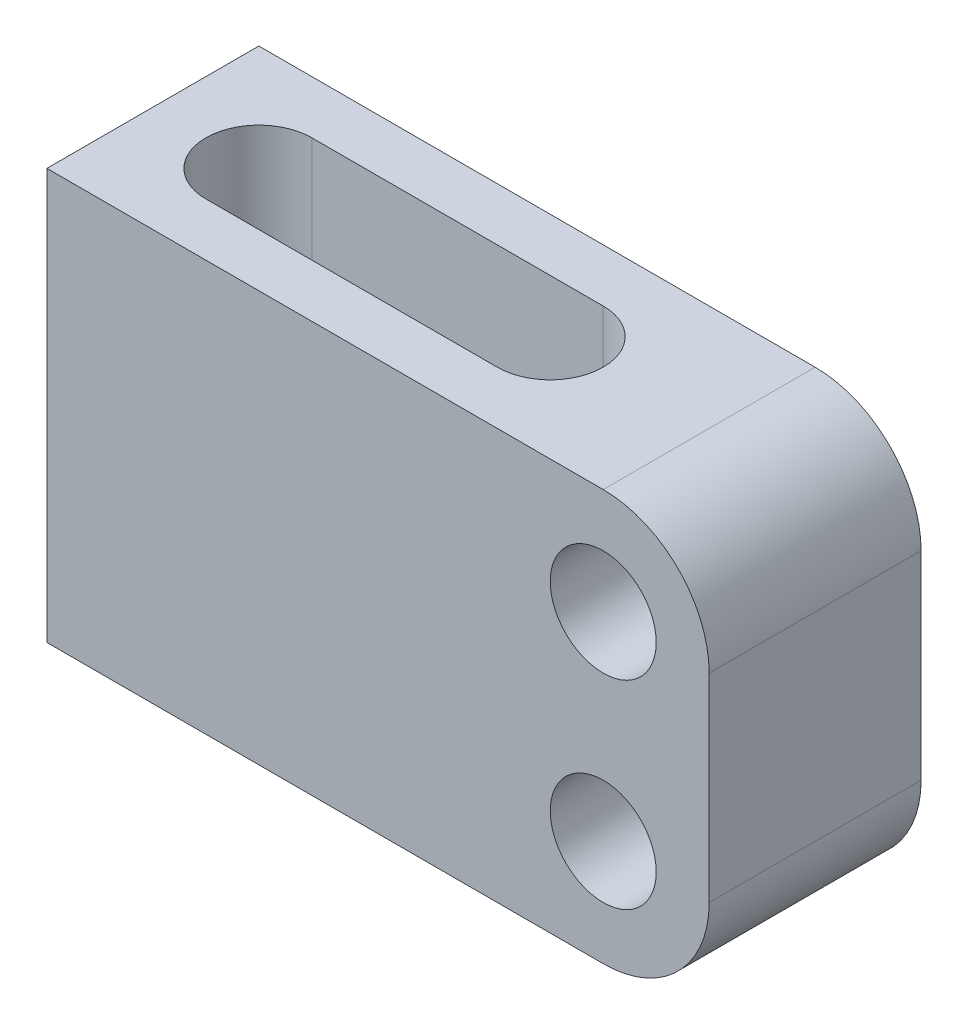
ISO-10303-21;
HEADER;
FILE_DESCRIPTION(('STEP AP214'),'2;1');
FILE_NAME('part.step','',(''),(''),'','','');
FILE_SCHEMA(('AUTOMOTIVE_DESIGN { 1 0 10303 214 1 1 1 1 }'));
ENDSEC;
DATA;
#1=APPLICATION_CONTEXT('core data for automotive mechanical design processes');
#2=APPLICATION_PROTOCOL_DEFINITION('international standard','automotive_design',2000,#1);
#3=PRODUCT_CONTEXT('',#1,'mechanical');
#4=PRODUCT('Part','Part','',(#3));
#5=PRODUCT_RELATED_PRODUCT_CATEGORY('part','',(#4));
#6=PRODUCT_DEFINITION_FORMATION('','',#4);
#7=PRODUCT_DEFINITION_CONTEXT('part definition',#1,'design');
#8=PRODUCT_DEFINITION('design','',#6,#7);
#9=PRODUCT_DEFINITION_SHAPE('','',#8);
#10=(LENGTH_UNIT() NAMED_UNIT(*) SI_UNIT(.MILLI.,.METRE.));
#11=(NAMED_UNIT(*) PLANE_ANGLE_UNIT() SI_UNIT($,.RADIAN.));
#12=(NAMED_UNIT(*) SI_UNIT($,.STERADIAN.) SOLID_ANGLE_UNIT());
#13=UNCERTAINTY_MEASURE_WITH_UNIT(LENGTH_MEASURE(1.E-05),#10,'distance_accuracy_value','');
#14=(GEOMETRIC_REPRESENTATION_CONTEXT(3) GLOBAL_UNCERTAINTY_ASSIGNED_CONTEXT((#13)) GLOBAL_UNIT_ASSIGNED_CONTEXT((#10,
#11,#12)) REPRESENTATION_CONTEXT('',''));
#15=CARTESIAN_POINT('',(0.,0.,0.));
#16=DIRECTION('',(0.,0.,1.));
#17=DIRECTION('',(1.,0.,0.));
#18=AXIS2_PLACEMENT_3D('',#15,#16,#17);
#19=CARTESIAN_POINT('',(0.,-15.,-16.));
#20=DIRECTION('',(0.,0.,1.));
#21=DIRECTION('',(1.,0.,0.));
#22=AXIS2_PLACEMENT_3D('',#19,#20,#21);
#23=CYLINDRICAL_SURFACE('',#22,8.);
#24=CARTESIAN_POINT('',(0.,-15.,0.));
#25=DIRECTION('',(0.,0.,1.));
#26=DIRECTION('',(-1.,0.,0.));
#27=AXIS2_PLACEMENT_3D('',#24,#25,#26);
#28=CIRCLE('',#27,8.);
#29=CARTESIAN_POINT('',(0.,-23.,0.));
#30=VERTEX_POINT('',#29);
#31=CARTESIAN_POINT('',(8.00000000000001,-15.,0.));
#32=VERTEX_POINT('',#31);
#33=EDGE_CURVE('E156',#30,#32,#28,.T.);
#34=ORIENTED_EDGE('',*,*,#33,.F.);
#35=DIRECTION('',(0.,0.,1.));
#36=VECTOR('',#35,1.);
#37=CARTESIAN_POINT('',(0.,-23.,-16.));
#38=LINE('',#37,#36);
#39=CARTESIAN_POINT('',(0.,-23.,-16.));
#40=VERTEX_POINT('',#39);
#41=EDGE_CURVE('E11',#40,#30,#38,.T.);
#42=ORIENTED_EDGE('',*,*,#41,.F.);
#43=CARTESIAN_POINT('',(0.,-15.,-16.));
#44=DIRECTION('',(0.,0.,1.));
#45=DIRECTION('',(-1.,0.,0.));
#46=AXIS2_PLACEMENT_3D('',#43,#44,#45);
#47=CIRCLE('',#46,8.);
#48=CARTESIAN_POINT('',(8.00000000000001,-15.,-16.));
#49=VERTEX_POINT('',#48);
#50=EDGE_CURVE('E159',#40,#49,#47,.T.);
#51=ORIENTED_EDGE('',*,*,#50,.T.);
#52=DIRECTION('',(0.,0.,1.));
#53=VECTOR('',#52,1.);
#54=CARTESIAN_POINT('',(8.00000000000001,-15.,-16.));
#55=LINE('',#54,#53);
#56=EDGE_CURVE('E36',#49,#32,#55,.T.);
#57=ORIENTED_EDGE('',*,*,#56,.T.);
#58=EDGE_LOOP('',(#34,#42,#51,#57));
#59=FACE_BOUND('',#58,.T.);
#60=ADVANCED_FACE('F33',(#59),#23,.T.);
#61=CARTESIAN_POINT('',(-42.,-23.,-16.));
#62=DIRECTION('',(0.,-1.,0.));
#63=DIRECTION('',(0.,0.,-1.));
#64=AXIS2_PLACEMENT_3D('',#61,#62,#63);
#65=PLANE('',#64);
#66=CARTESIAN_POINT('',(-34.,-23.,-8.));
#67=DIRECTION('',(0.,1.,0.));
#68=DIRECTION('',(-1.,0.,0.));
#69=AXIS2_PLACEMENT_3D('',#66,#67,#68);
#70=CIRCLE('',#69,4.);
#71=CARTESIAN_POINT('',(-34.,-23.,-12.));
#72=VERTEX_POINT('',#71);
#73=CARTESIAN_POINT('',(-34.,-23.,-4.));
#74=VERTEX_POINT('',#73);
#75=EDGE_CURVE('E112',#72,#74,#70,.T.);
#76=ORIENTED_EDGE('',*,*,#75,.T.);
#77=DIRECTION('',(1.,0.,0.));
#78=VECTOR('',#77,1.);
#79=CARTESIAN_POINT('',(-34.,-23.,-4.));
#80=LINE('',#79,#78);
#81=CARTESIAN_POINT('',(-12.,-23.,-4.));
#82=VERTEX_POINT('',#81);
#83=EDGE_CURVE('E121',#74,#82,#80,.T.);
#84=ORIENTED_EDGE('',*,*,#83,.T.);
#85=CARTESIAN_POINT('',(-12.,-23.,-8.));
#86=DIRECTION('',(0.,1.,0.));
#87=DIRECTION('',(-1.,0.,0.));
#88=AXIS2_PLACEMENT_3D('',#85,#86,#87);
#89=CIRCLE('',#88,4.);
#90=CARTESIAN_POINT('',(-12.,-23.,-12.));
#91=VERTEX_POINT('',#90);
#92=EDGE_CURVE('E49',#82,#91,#89,.T.);
#93=ORIENTED_EDGE('',*,*,#92,.T.);
#94=DIRECTION('',(-1.,0.,0.));
#95=VECTOR('',#94,1.);
#96=CARTESIAN_POINT('',(-34.,-23.,-12.));
#97=LINE('',#96,#95);
#98=EDGE_CURVE('E118',#91,#72,#97,.T.);
#99=ORIENTED_EDGE('',*,*,#98,.T.);
#100=EDGE_LOOP('',(#76,#84,#93,#99));
#101=FACE_BOUND('',#100,.T.);
#102=DIRECTION('',(1.,0.,0.));
#103=VECTOR('',#102,1.);
#104=CARTESIAN_POINT('',(-42.,-23.,0.));
#105=LINE('',#104,#103);
#106=CARTESIAN_POINT('',(-42.,-23.,0.));
#107=VERTEX_POINT('',#106);
#108=EDGE_CURVE('E163',#107,#30,#105,.T.);
#109=ORIENTED_EDGE('',*,*,#108,.F.);
#110=DIRECTION('',(0.,0.,1.));
#111=VECTOR('',#110,1.);
#112=CARTESIAN_POINT('',(-42.,-23.,-16.));
#113=LINE('',#112,#111);
#114=CARTESIAN_POINT('',(-42.,-23.,-16.));
#115=VERTEX_POINT('',#114);
#116=EDGE_CURVE('E41',#115,#107,#113,.T.);
#117=ORIENTED_EDGE('',*,*,#116,.F.);
#118=DIRECTION('',(1.,0.,0.));
#119=VECTOR('',#118,1.);
#120=CARTESIAN_POINT('',(-42.,-23.,-16.));
#121=LINE('',#120,#119);
#122=EDGE_CURVE('E175',#115,#40,#121,.T.);
#123=ORIENTED_EDGE('',*,*,#122,.T.);
#124=ORIENTED_EDGE('',*,*,#41,.T.);
#125=EDGE_LOOP('',(#109,#117,#123,#124));
#126=FACE_BOUND('',#125,.T.);
#127=ADVANCED_FACE('F125',(#101,#126),#65,.T.);
#128=CARTESIAN_POINT('',(-42.,7.99999999999999,-16.));
#129=DIRECTION('',(-1.,0.,0.));
#130=DIRECTION('',(0.,0.,1.));
#131=AXIS2_PLACEMENT_3D('',#128,#129,#130);
#132=PLANE('',#131);
#133=DIRECTION('',(0.,-1.,0.));
#134=VECTOR('',#133,1.);
#135=CARTESIAN_POINT('',(-42.,7.99999999999999,0.));
#136=LINE('',#135,#134);
#137=CARTESIAN_POINT('',(-42.,7.99999999999999,0.));
#138=VERTEX_POINT('',#137);
#139=EDGE_CURVE('E189',#138,#107,#136,.T.);
#140=ORIENTED_EDGE('',*,*,#139,.F.);
#141=DIRECTION('',(0.,0.,1.));
#142=VECTOR('',#141,1.);
#143=CARTESIAN_POINT('',(-42.,7.99999999999999,-16.));
#144=LINE('',#143,#142);
#145=CARTESIAN_POINT('',(-42.,7.99999999999999,-16.));
#146=VERTEX_POINT('',#145);
#147=EDGE_CURVE('E195',#146,#138,#144,.T.);
#148=ORIENTED_EDGE('',*,*,#147,.F.);
#149=DIRECTION('',(0.,-1.,0.));
#150=VECTOR('',#149,1.);
#151=CARTESIAN_POINT('',(-42.,7.99999999999999,-16.));
#152=LINE('',#151,#150);
#153=EDGE_CURVE('E172',#146,#115,#152,.T.);
#154=ORIENTED_EDGE('',*,*,#153,.T.);
#155=ORIENTED_EDGE('',*,*,#116,.T.);
#156=EDGE_LOOP('',(#140,#148,#154,#155));
#157=FACE_BOUND('',#156,.T.);
#158=ADVANCED_FACE('F223',(#157),#132,.T.);
#159=CARTESIAN_POINT('',(0.,8.,-16.));
#160=DIRECTION('',(0.,1.,0.));
#161=DIRECTION('',(-1.,0.,0.));
#162=AXIS2_PLACEMENT_3D('',#159,#160,#161);
#163=PLANE('',#162);
#164=CARTESIAN_POINT('',(-34.,8.,-8.));
#165=DIRECTION('',(0.,1.,0.));
#166=DIRECTION('',(-1.,0.,0.));
#167=AXIS2_PLACEMENT_3D('',#164,#165,#166);
#168=CIRCLE('',#167,4.);
#169=CARTESIAN_POINT('',(-34.,8.,-12.));
#170=VERTEX_POINT('',#169);
#171=CARTESIAN_POINT('',(-34.,8.,-4.));
#172=VERTEX_POINT('',#171);
#173=EDGE_CURVE('E57',#170,#172,#168,.T.);
#174=ORIENTED_EDGE('',*,*,#173,.F.);
#175=DIRECTION('',(-1.,0.,0.));
#176=VECTOR('',#175,1.);
#177=CARTESIAN_POINT('',(-34.,8.,-12.));
#178=LINE('',#177,#176);
#179=CARTESIAN_POINT('',(-12.,8.,-12.));
#180=VERTEX_POINT('',#179);
#181=EDGE_CURVE('E128',#180,#170,#178,.T.);
#182=ORIENTED_EDGE('',*,*,#181,.F.);
#183=CARTESIAN_POINT('',(-12.,8.,-8.));
#184=DIRECTION('',(0.,1.,0.));
#185=DIRECTION('',(-1.,0.,0.));
#186=AXIS2_PLACEMENT_3D('',#183,#184,#185);
#187=CIRCLE('',#186,4.);
#188=CARTESIAN_POINT('',(-12.,8.,-4.));
#189=VERTEX_POINT('',#188);
#190=EDGE_CURVE('E131',#189,#180,#187,.T.);
#191=ORIENTED_EDGE('',*,*,#190,.F.);
#192=DIRECTION('',(1.,0.,0.));
#193=VECTOR('',#192,1.);
#194=CARTESIAN_POINT('',(-34.,8.,-4.));
#195=LINE('',#194,#193);
#196=EDGE_CURVE('E137',#172,#189,#195,.T.);
#197=ORIENTED_EDGE('',*,*,#196,.F.);
#198=EDGE_LOOP('',(#174,#182,#191,#197));
#199=FACE_BOUND('',#198,.T.);
#200=DIRECTION('',(-1.,0.,0.));
#201=VECTOR('',#200,1.);
#202=CARTESIAN_POINT('',(0.,8.,0.));
#203=LINE('',#202,#201);
#204=CARTESIAN_POINT('',(0.,8.,0.));
#205=VERTEX_POINT('',#204);
#206=EDGE_CURVE('E186',#205,#138,#203,.T.);
#207=ORIENTED_EDGE('',*,*,#206,.F.);
#208=DIRECTION('',(0.,0.,1.));
#209=VECTOR('',#208,1.);
#210=CARTESIAN_POINT('',(0.,8.,-16.));
#211=LINE('',#210,#209);
#212=CARTESIAN_POINT('',(0.,8.,-16.));
#213=VERTEX_POINT('',#212);
#214=EDGE_CURVE('E197',#213,#205,#211,.T.);
#215=ORIENTED_EDGE('',*,*,#214,.F.);
#216=DIRECTION('',(-1.,0.,0.));
#217=VECTOR('',#216,1.);
#218=CARTESIAN_POINT('',(0.,8.,-16.));
#219=LINE('',#218,#217);
#220=EDGE_CURVE('E169',#213,#146,#219,.T.);
#221=ORIENTED_EDGE('',*,*,#220,.T.);
#222=ORIENTED_EDGE('',*,*,#147,.T.);
#223=EDGE_LOOP('',(#207,#215,#221,#222));
#224=FACE_BOUND('',#223,.T.);
#225=ADVANCED_FACE('F221',(#199,#224),#163,.T.);
#226=CARTESIAN_POINT('',(0.,0.,-16.));
#227=DIRECTION('',(0.,0.,1.));
#228=DIRECTION('',(1.,0.,0.));
#229=AXIS2_PLACEMENT_3D('',#226,#227,#228);
#230=CYLINDRICAL_SURFACE('',#229,8.);
#231=CARTESIAN_POINT('',(0.,0.,0.));
#232=DIRECTION('',(0.,0.,1.));
#233=DIRECTION('',(1.,0.,0.));
#234=AXIS2_PLACEMENT_3D('',#231,#232,#233);
#235=CIRCLE('',#234,8.);
#236=CARTESIAN_POINT('',(8.,0.,0.));
#237=VERTEX_POINT('',#236);
#238=EDGE_CURVE('E183',#237,#205,#235,.T.);
#239=ORIENTED_EDGE('',*,*,#238,.F.);
#240=DIRECTION('',(0.,0.,1.));
#241=VECTOR('',#240,1.);
#242=CARTESIAN_POINT('',(8.,0.,-16.));
#243=LINE('',#242,#241);
#244=CARTESIAN_POINT('',(8.,0.,-16.));
#245=VERTEX_POINT('',#244);
#246=EDGE_CURVE('E198',#245,#237,#243,.T.);
#247=ORIENTED_EDGE('',*,*,#246,.F.);
#248=CARTESIAN_POINT('',(0.,0.,-16.));
#249=DIRECTION('',(0.,0.,1.));
#250=DIRECTION('',(1.,0.,0.));
#251=AXIS2_PLACEMENT_3D('',#248,#249,#250);
#252=CIRCLE('',#251,8.);
#253=EDGE_CURVE('E166',#245,#213,#252,.T.);
#254=ORIENTED_EDGE('',*,*,#253,.T.);
#255=ORIENTED_EDGE('',*,*,#214,.T.);
#256=EDGE_LOOP('',(#239,#247,#254,#255));
#257=FACE_BOUND('',#256,.T.);
#258=ADVANCED_FACE('F218',(#257),#230,.T.);
#259=CARTESIAN_POINT('',(8.,0.,-16.));
#260=DIRECTION('',(1.,0.,0.));
#261=DIRECTION('',(0.,1.,0.));
#262=AXIS2_PLACEMENT_3D('',#259,#260,#261);
#263=PLANE('',#262);
#264=DIRECTION('',(0.,1.,0.));
#265=VECTOR('',#264,1.);
#266=CARTESIAN_POINT('',(8.,0.,0.));
#267=LINE('',#266,#265);
#268=EDGE_CURVE('E180',#32,#237,#267,.T.);
#269=ORIENTED_EDGE('',*,*,#268,.F.);
#270=ORIENTED_EDGE('',*,*,#56,.F.);
#271=DIRECTION('',(0.,1.,0.));
#272=VECTOR('',#271,1.);
#273=CARTESIAN_POINT('',(8.,0.,-16.));
#274=LINE('',#273,#272);
#275=EDGE_CURVE('E162',#49,#245,#274,.T.);
#276=ORIENTED_EDGE('',*,*,#275,.T.);
#277=ORIENTED_EDGE('',*,*,#246,.T.);
#278=EDGE_LOOP('',(#269,#270,#276,#277));
#279=FACE_BOUND('',#278,.T.);
#280=ADVANCED_FACE('F206',(#279),#263,.T.);
#281=CARTESIAN_POINT('',(0.,-15.,-16.));
#282=DIRECTION('',(0.,0.,-1.));
#283=DIRECTION('',(-1.,0.,0.));
#284=AXIS2_PLACEMENT_3D('',#281,#282,#283);
#285=PLANE('',#284);
#286=CARTESIAN_POINT('',(0.,-15.,-16.));
#287=DIRECTION('',(0.,0.,1.));
#288=DIRECTION('',(1.,0.,0.));
#289=AXIS2_PLACEMENT_3D('',#286,#287,#288);
#290=CIRCLE('',#289,4.);
#291=CARTESIAN_POINT('',(4.,-15.,-16.));
#292=VERTEX_POINT('',#291);
#293=EDGE_CURVE('E147',#292,#292,#290,.T.);
#294=ORIENTED_EDGE('',*,*,#293,.T.);
#295=EDGE_LOOP('',(#294));
#296=FACE_BOUND('',#295,.T.);
#297=CARTESIAN_POINT('',(0.,0.,-16.));
#298=DIRECTION('',(0.,0.,1.));
#299=DIRECTION('',(1.,0.,0.));
#300=AXIS2_PLACEMENT_3D('',#297,#298,#299);
#301=CIRCLE('',#300,4.);
#302=CARTESIAN_POINT('',(4.,0.,-16.));
#303=VERTEX_POINT('',#302);
#304=EDGE_CURVE('E153',#303,#303,#301,.T.);
#305=ORIENTED_EDGE('',*,*,#304,.T.);
#306=EDGE_LOOP('',(#305));
#307=FACE_BOUND('',#306,.T.);
#308=ORIENTED_EDGE('',*,*,#50,.F.);
#309=ORIENTED_EDGE('',*,*,#122,.F.);
#310=ORIENTED_EDGE('',*,*,#153,.F.);
#311=ORIENTED_EDGE('',*,*,#220,.F.);
#312=ORIENTED_EDGE('',*,*,#253,.F.);
#313=ORIENTED_EDGE('',*,*,#275,.F.);
#314=EDGE_LOOP('',(#308,#309,#310,#311,#312,#313));
#315=FACE_BOUND('',#314,.T.);
#316=ADVANCED_FACE('F213',(#296,#307,#315),#285,.T.);
#317=CARTESIAN_POINT('',(0.,-15.,0.));
#318=DIRECTION('',(0.,0.,-1.));
#319=DIRECTION('',(-1.,0.,0.));
#320=AXIS2_PLACEMENT_3D('',#317,#318,#319);
#321=PLANE('',#320);
#322=CARTESIAN_POINT('',(0.,-15.,0.));
#323=DIRECTION('',(0.,0.,1.));
#324=DIRECTION('',(1.,0.,0.));
#325=AXIS2_PLACEMENT_3D('',#322,#323,#324);
#326=CIRCLE('',#325,4.);
#327=CARTESIAN_POINT('',(4.,-15.,0.));
#328=VERTEX_POINT('',#327);
#329=EDGE_CURVE('E143',#328,#328,#326,.T.);
#330=ORIENTED_EDGE('',*,*,#329,.F.);
#331=EDGE_LOOP('',(#330));
#332=FACE_BOUND('',#331,.T.);
#333=CARTESIAN_POINT('',(0.,0.,0.));
#334=DIRECTION('',(0.,0.,1.));
#335=DIRECTION('',(1.,0.,0.));
#336=AXIS2_PLACEMENT_3D('',#333,#334,#335);
#337=CIRCLE('',#336,4.);
#338=CARTESIAN_POINT('',(4.,0.,0.));
#339=VERTEX_POINT('',#338);
#340=EDGE_CURVE('E150',#339,#339,#337,.T.);
#341=ORIENTED_EDGE('',*,*,#340,.F.);
#342=EDGE_LOOP('',(#341));
#343=FACE_BOUND('',#342,.T.);
#344=ORIENTED_EDGE('',*,*,#33,.T.);
#345=ORIENTED_EDGE('',*,*,#268,.T.);
#346=ORIENTED_EDGE('',*,*,#238,.T.);
#347=ORIENTED_EDGE('',*,*,#206,.T.);
#348=ORIENTED_EDGE('',*,*,#139,.T.);
#349=ORIENTED_EDGE('',*,*,#108,.T.);
#350=EDGE_LOOP('',(#344,#345,#346,#347,#348,#349));
#351=FACE_BOUND('',#350,.T.);
#352=ADVANCED_FACE('F208',(#332,#343,#351),#321,.F.);
#353=CARTESIAN_POINT('',(0.,0.,-16.));
#354=DIRECTION('',(0.,0.,1.));
#355=DIRECTION('',(1.,0.,0.));
#356=AXIS2_PLACEMENT_3D('',#353,#354,#355);
#357=CYLINDRICAL_SURFACE('',#356,4.);
#358=ORIENTED_EDGE('',*,*,#304,.F.);
#359=EDGE_LOOP('',(#358));
#360=FACE_BOUND('',#359,.T.);
#361=ORIENTED_EDGE('',*,*,#340,.T.);
#362=EDGE_LOOP('',(#361));
#363=FACE_BOUND('',#362,.T.);
#364=ADVANCED_FACE('F296',(#360,#363),#357,.F.);
#365=CARTESIAN_POINT('',(0.,-15.,-16.));
#366=DIRECTION('',(0.,0.,1.));
#367=DIRECTION('',(1.,0.,0.));
#368=AXIS2_PLACEMENT_3D('',#365,#366,#367);
#369=CYLINDRICAL_SURFACE('',#368,4.);
#370=ORIENTED_EDGE('',*,*,#293,.F.);
#371=EDGE_LOOP('',(#370));
#372=FACE_BOUND('',#371,.T.);
#373=ORIENTED_EDGE('',*,*,#329,.T.);
#374=EDGE_LOOP('',(#373));
#375=FACE_BOUND('',#374,.T.);
#376=ADVANCED_FACE('F247',(#372,#375),#369,.F.);
#377=CARTESIAN_POINT('',(-34.,-23.,-8.));
#378=DIRECTION('',(0.,1.,0.));
#379=DIRECTION('',(-1.,0.,0.));
#380=AXIS2_PLACEMENT_3D('',#377,#378,#379);
#381=CYLINDRICAL_SURFACE('',#380,4.);
#382=ORIENTED_EDGE('',*,*,#173,.T.);
#383=DIRECTION('',(0.,1.,0.));
#384=VECTOR('',#383,1.);
#385=CARTESIAN_POINT('',(-34.,-23.,-4.));
#386=LINE('',#385,#384);
#387=EDGE_CURVE('E108',#74,#172,#386,.T.);
#388=ORIENTED_EDGE('',*,*,#387,.F.);
#389=ORIENTED_EDGE('',*,*,#75,.F.);
#390=DIRECTION('',(0.,1.,0.));
#391=VECTOR('',#390,1.);
#392=CARTESIAN_POINT('',(-34.,-23.,-12.));
#393=LINE('',#392,#391);
#394=EDGE_CURVE('E141',#72,#170,#393,.T.);
#395=ORIENTED_EDGE('',*,*,#394,.T.);
#396=EDGE_LOOP('',(#382,#388,#389,#395));
#397=FACE_BOUND('',#396,.T.);
#398=ADVANCED_FACE('F110',(#397),#381,.F.);
#399=CARTESIAN_POINT('',(-34.,-23.,-12.));
#400=DIRECTION('',(0.,0.,-1.));
#401=DIRECTION('',(-1.,0.,0.));
#402=AXIS2_PLACEMENT_3D('',#399,#400,#401);
#403=PLANE('',#402);
#404=ORIENTED_EDGE('',*,*,#181,.T.);
#405=ORIENTED_EDGE('',*,*,#394,.F.);
#406=ORIENTED_EDGE('',*,*,#98,.F.);
#407=DIRECTION('',(0.,1.,0.));
#408=VECTOR('',#407,1.);
#409=CARTESIAN_POINT('',(-12.,-23.,-12.));
#410=LINE('',#409,#408);
#411=EDGE_CURVE('E144',#91,#180,#410,.T.);
#412=ORIENTED_EDGE('',*,*,#411,.T.);
#413=EDGE_LOOP('',(#404,#405,#406,#412));
#414=FACE_BOUND('',#413,.T.);
#415=ADVANCED_FACE('F264',(#414),#403,.F.);
#416=CARTESIAN_POINT('',(-12.,-23.,-8.));
#417=DIRECTION('',(0.,1.,0.));
#418=DIRECTION('',(-1.,0.,0.));
#419=AXIS2_PLACEMENT_3D('',#416,#417,#418);
#420=CYLINDRICAL_SURFACE('',#419,4.);
#421=ORIENTED_EDGE('',*,*,#190,.T.);
#422=ORIENTED_EDGE('',*,*,#411,.F.);
#423=ORIENTED_EDGE('',*,*,#92,.F.);
#424=DIRECTION('',(0.,1.,0.));
#425=VECTOR('',#424,1.);
#426=CARTESIAN_POINT('',(-12.,-23.,-4.));
#427=LINE('',#426,#425);
#428=EDGE_CURVE('E117',#82,#189,#427,.T.);
#429=ORIENTED_EDGE('',*,*,#428,.T.);
#430=EDGE_LOOP('',(#421,#422,#423,#429));
#431=FACE_BOUND('',#430,.T.);
#432=ADVANCED_FACE('F273',(#431),#420,.F.);
#433=CARTESIAN_POINT('',(-34.,-23.,-4.));
#434=DIRECTION('',(0.,0.,1.));
#435=DIRECTION('',(1.,0.,0.));
#436=AXIS2_PLACEMENT_3D('',#433,#434,#435);
#437=PLANE('',#436);
#438=ORIENTED_EDGE('',*,*,#196,.T.);
#439=ORIENTED_EDGE('',*,*,#428,.F.);
#440=ORIENTED_EDGE('',*,*,#83,.F.);
#441=ORIENTED_EDGE('',*,*,#387,.T.);
#442=EDGE_LOOP('',(#438,#439,#440,#441));
#443=FACE_BOUND('',#442,.T.);
#444=ADVANCED_FACE('F122',(#443),#437,.F.);
#445=CLOSED_SHELL('',(#60,#127,#158,#225,#258,#280,#316,#352,#364,#376,#398,#415,#432,#444));
#446=MANIFOLD_SOLID_BREP('B2',#445);
#447=ADVANCED_BREP_SHAPE_REPRESENTATION('',(#18,#446),#14);
#448=SHAPE_DEFINITION_REPRESENTATION(#9,#447);
ENDSEC;
END-ISO-10303-21;
